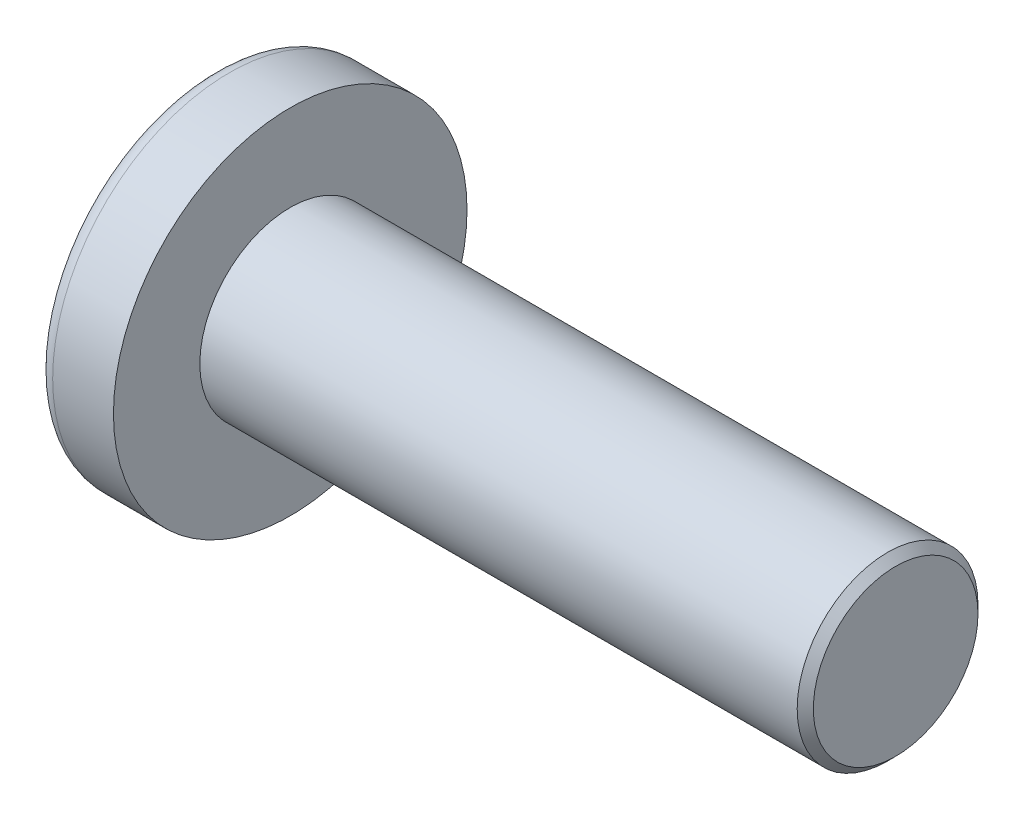
ISO-10303-21;
HEADER;
FILE_DESCRIPTION(('STEP AP214'),'2;1');
FILE_NAME('part.step','',(''),(''),'','','');
FILE_SCHEMA(('AUTOMOTIVE_DESIGN { 1 0 10303 214 1 1 1 1 }'));
ENDSEC;
DATA;
#1=APPLICATION_CONTEXT('core data for automotive mechanical design processes');
#2=APPLICATION_PROTOCOL_DEFINITION('international standard','automotive_design',2000,#1);
#3=PRODUCT_CONTEXT('',#1,'mechanical');
#4=PRODUCT('Part','Part','',(#3));
#5=PRODUCT_RELATED_PRODUCT_CATEGORY('part','',(#4));
#6=PRODUCT_DEFINITION_FORMATION('','',#4);
#7=PRODUCT_DEFINITION_CONTEXT('part definition',#1,'design');
#8=PRODUCT_DEFINITION('design','',#6,#7);
#9=PRODUCT_DEFINITION_SHAPE('','',#8);
#10=(LENGTH_UNIT() NAMED_UNIT(*) SI_UNIT(.MILLI.,.METRE.));
#11=(NAMED_UNIT(*) PLANE_ANGLE_UNIT() SI_UNIT($,.RADIAN.));
#12=(NAMED_UNIT(*) SI_UNIT($,.STERADIAN.) SOLID_ANGLE_UNIT());
#13=UNCERTAINTY_MEASURE_WITH_UNIT(LENGTH_MEASURE(1.E-05),#10,'distance_accuracy_value','');
#14=(GEOMETRIC_REPRESENTATION_CONTEXT(3) GLOBAL_UNCERTAINTY_ASSIGNED_CONTEXT((#13)) GLOBAL_UNIT_ASSIGNED_CONTEXT((#10,
#11,#12)) REPRESENTATION_CONTEXT('',''));
#15=CARTESIAN_POINT('',(0.,0.,0.));
#16=DIRECTION('',(0.,0.,1.));
#17=DIRECTION('',(1.,0.,0.));
#18=AXIS2_PLACEMENT_3D('',#15,#16,#17);
#19=CARTESIAN_POINT('',(4.55168,0.,0.));
#20=DIRECTION('',(-1.,0.,0.));
#21=DIRECTION('',(0.,1.,0.));
#22=AXIS2_PLACEMENT_3D('',#19,#20,#21);
#23=SPHERICAL_SURFACE('',#22,4.55168);
#24=CARTESIAN_POINT('',(0.870207289833471,0.,0.));
#25=DIRECTION('',(-1.,0.,0.));
#26=DIRECTION('',(0.,0.,1.));
#27=AXIS2_PLACEMENT_3D('',#24,#25,#26);
#28=CIRCLE('',#27,2.67666761229315);
#29=CARTESIAN_POINT('',(0.870207289833471,0.,2.67666761229315));
#30=VERTEX_POINT('',#29);
#31=EDGE_CURVE('E139',#30,#30,#28,.T.);
#32=ORIENTED_EDGE('',*,*,#31,.T.);
#33=EDGE_LOOP('',(#32));
#34=FACE_BOUND('',#33,.T.);
#35=CARTESIAN_POINT('',(4.54621406502776,-0.053976107850912,0.));
#36=DIRECTION('',(-0.100750553686815,-0.9949117176573,0.));
#37=DIRECTION('',(0.994911717657301,-0.100750553686815,0.));
#38=AXIS2_PLACEMENT_3D('',#35,#36,#37);
#39=CIRCLE('',#38,4.55135666870178);
#40=CARTESIAN_POINT('',(0.29828010421487,0.376194419826337,1.57634320737159));
#41=VERTEX_POINT('',#40);
#42=CARTESIAN_POINT('',(0.0357821905509178,0.402776487032817,0.402776487032818));
#43=VERTEX_POINT('',#42);
#44=EDGE_CURVE('E135',#41,#43,#39,.T.);
#45=ORIENTED_EDGE('',*,*,#44,.F.);
#46=CARTESIAN_POINT('',(3.65196023945684,0.,-1.11933639500645));
#47=DIRECTION('',(0.626498155753381,0.,0.77942290243334));
#48=DIRECTION('',(0.77942290243334,0.,-0.626498155753381));
#49=AXIS2_PLACEMENT_3D('',#46,#47,#48);
#50=CIRCLE('',#49,4.31918756361681);
#51=CARTESIAN_POINT('',(0.298280104214868,-0.376194419826347,1.57634320737159));
#52=VERTEX_POINT('',#51);
#53=EDGE_CURVE('E127',#41,#52,#50,.T.);
#54=ORIENTED_EDGE('',*,*,#53,.T.);
#55=CARTESIAN_POINT('',(4.54621406502775,0.053976107850911,0.));
#56=DIRECTION('',(-0.100750553686815,0.994911717657301,0.));
#57=DIRECTION('',(-0.994911717657301,-0.100750553686815,0.));
#58=AXIS2_PLACEMENT_3D('',#55,#56,#57);
#59=CIRCLE('',#58,4.55135666870178);
#60=CARTESIAN_POINT('',(0.0357821905509178,-0.402776487032819,0.402776487032818));
#61=VERTEX_POINT('',#60);
#62=EDGE_CURVE('E379',#61,#52,#59,.T.);
#63=ORIENTED_EDGE('',*,*,#62,.F.);
#64=CARTESIAN_POINT('',(4.54621406502775,0.,-0.0539761078509111));
#65=DIRECTION('',(-0.100750553686815,0.,-0.994911717657301));
#66=DIRECTION('',(-0.994911717657301,0.,0.100750553686815));
#67=AXIS2_PLACEMENT_3D('',#64,#65,#66);
#68=CIRCLE('',#67,4.55135666870178);
#69=CARTESIAN_POINT('',(0.298280104214867,-1.57634320737159,0.376194419826342));
#70=VERTEX_POINT('',#69);
#71=EDGE_CURVE('E173',#70,#61,#68,.T.);
#72=ORIENTED_EDGE('',*,*,#71,.F.);
#73=CARTESIAN_POINT('',(3.65196023945684,1.11933639500645,0.));
#74=DIRECTION('',(0.626498155753381,-0.77942290243334,0.));
#75=DIRECTION('',(0.77942290243334,0.626498155753381,0.));
#76=AXIS2_PLACEMENT_3D('',#73,#74,#75);
#77=CIRCLE('',#76,4.31918756361681);
#78=CARTESIAN_POINT('',(0.298280104214867,-1.57634320737159,-0.376194419826343));
#79=VERTEX_POINT('',#78);
#80=EDGE_CURVE('E169',#70,#79,#77,.T.);
#81=ORIENTED_EDGE('',*,*,#80,.T.);
#82=CARTESIAN_POINT('',(4.54621406502775,0.,0.053976107850912));
#83=DIRECTION('',(-0.100750553686815,0.,0.9949117176573));
#84=DIRECTION('',(0.994911717657301,0.,0.100750553686815));
#85=AXIS2_PLACEMENT_3D('',#82,#83,#84);
#86=CIRCLE('',#85,4.55135666870178);
#87=CARTESIAN_POINT('',(0.0357821905509169,-0.402776487032816,-0.402776487032819));
#88=VERTEX_POINT('',#87);
#89=EDGE_CURVE('E53',#88,#79,#86,.T.);
#90=ORIENTED_EDGE('',*,*,#89,.F.);
#91=CARTESIAN_POINT('',(0.298280104214869,-0.376194419826336,-1.57634320737159));
#92=VERTEX_POINT('',#91);
#93=EDGE_CURVE('E377',#92,#88,#59,.T.);
#94=ORIENTED_EDGE('',*,*,#93,.F.);
#95=CARTESIAN_POINT('',(3.65196023945684,0.,1.11933639500645));
#96=DIRECTION('',(0.626498155753381,0.,-0.77942290243334));
#97=DIRECTION('',(-0.77942290243334,0.,-0.626498155753381));
#98=AXIS2_PLACEMENT_3D('',#95,#96,#97);
#99=CIRCLE('',#98,4.31918756361681);
#100=CARTESIAN_POINT('',(0.29828010421487,0.376194419826348,-1.57634320737159));
#101=VERTEX_POINT('',#100);
#102=EDGE_CURVE('E384',#92,#101,#99,.T.);
#103=ORIENTED_EDGE('',*,*,#102,.T.);
#104=CARTESIAN_POINT('',(0.0357821905509186,0.40277648703282,-0.402776487032818));
#105=VERTEX_POINT('',#104);
#106=EDGE_CURVE('E112',#105,#101,#39,.T.);
#107=ORIENTED_EDGE('',*,*,#106,.F.);
#108=CARTESIAN_POINT('',(0.29828010421487,1.57634320737159,-0.376194419826342));
#109=VERTEX_POINT('',#108);
#110=EDGE_CURVE('E134',#109,#105,#86,.T.);
#111=ORIENTED_EDGE('',*,*,#110,.F.);
#112=CARTESIAN_POINT('',(3.65196023945684,-1.11933639500645,0.));
#113=DIRECTION('',(0.626498155753381,0.77942290243334,0.));
#114=DIRECTION('',(-0.77942290243334,0.626498155753381,0.));
#115=AXIS2_PLACEMENT_3D('',#112,#113,#114);
#116=CIRCLE('',#115,4.31918756361681);
#117=CARTESIAN_POINT('',(0.29828010421487,1.57634320737159,0.376194419826342));
#118=VERTEX_POINT('',#117);
#119=EDGE_CURVE('E61',#109,#118,#116,.T.);
#120=ORIENTED_EDGE('',*,*,#119,.T.);
#121=EDGE_CURVE('E172',#43,#118,#68,.T.);
#122=ORIENTED_EDGE('',*,*,#121,.F.);
#123=EDGE_LOOP('',(#45,#54,#63,#72,#81,#90,#94,#103,#107,#111,#120,#122));
#124=FACE_BOUND('',#123,.T.);
#125=ADVANCED_FACE('F38',(#34,#124),#23,.T.);
#126=CARTESIAN_POINT('',(2.2594,0.,-0.1776));
#127=DIRECTION('',(-0.100750553686815,0.,0.9949117176573));
#128=DIRECTION('',(0.994911717657301,0.,0.100750553686815));
#129=AXIS2_PLACEMENT_3D('',#126,#127,#128);
#130=PLANE('',#129);
#131=ORIENTED_EDGE('',*,*,#110,.T.);
#132=DIRECTION('',(0.989900325021556,-0.100243070888259,0.100243070888259));
#133=VECTOR('',#132,1.);
#134=CARTESIAN_POINT('',(2.27702336316533,0.175815355628828,-0.175815355628827));
#135=LINE('',#134,#133);
#136=CARTESIAN_POINT('',(2.0066,0.203200000000001,-0.203199999999999));
#137=VERTEX_POINT('',#136);
#138=EDGE_CURVE('E110',#105,#137,#135,.T.);
#139=ORIENTED_EDGE('',*,*,#138,.T.);
#140=DIRECTION('',(0.777006374114706,-0.624555756408656,0.0786841897837678));
#141=VECTOR('',#140,1.);
#142=CARTESIAN_POINT('',(0.,1.8161,-0.4064));
#143=LINE('',#142,#141);
#144=EDGE_CURVE('E132',#109,#137,#143,.T.);
#145=ORIENTED_EDGE('',*,*,#144,.F.);
#146=EDGE_LOOP('',(#131,#139,#145));
#147=FACE_BOUND('',#146,.T.);
#148=ADVANCED_FACE('F131',(#147),#130,.T.);
#149=DIRECTION('',(0.777006374114707,0.624555756408656,0.0786841897837678));
#150=VECTOR('',#149,1.);
#151=CARTESIAN_POINT('',(0.,-1.8161,-0.4064));
#152=LINE('',#151,#150);
#153=CARTESIAN_POINT('',(2.0066,-0.2032,-0.2032));
#154=VERTEX_POINT('',#153);
#155=EDGE_CURVE('E154',#79,#154,#152,.T.);
#156=ORIENTED_EDGE('',*,*,#155,.T.);
#157=DIRECTION('',(-0.989900325021557,-0.100243070888258,-0.100243070888259));
#158=VECTOR('',#157,1.);
#159=CARTESIAN_POINT('',(2.27702336316533,-0.175815355628826,-0.175815355628827));
#160=LINE('',#159,#158);
#161=EDGE_CURVE('E368',#154,#88,#160,.T.);
#162=ORIENTED_EDGE('',*,*,#161,.T.);
#163=ORIENTED_EDGE('',*,*,#89,.T.);
#164=EDGE_LOOP('',(#156,#162,#163));
#165=FACE_BOUND('',#164,.T.);
#166=ADVANCED_FACE('F202',(#165),#130,.T.);
#167=CARTESIAN_POINT('',(2.2594,0.,0.1776));
#168=DIRECTION('',(-0.100750553686815,0.,-0.994911717657301));
#169=DIRECTION('',(-0.994911717657301,0.,0.100750553686815));
#170=AXIS2_PLACEMENT_3D('',#167,#168,#169);
#171=PLANE('',#170);
#172=DIRECTION('',(0.777006374114706,-0.624555756408657,-0.0786841897837675));
#173=VECTOR('',#172,1.);
#174=CARTESIAN_POINT('',(0.,1.8161,0.406399999999999));
#175=LINE('',#174,#173);
#176=CARTESIAN_POINT('',(2.0066,0.2032,0.2032));
#177=VERTEX_POINT('',#176);
#178=EDGE_CURVE('E140',#118,#177,#175,.T.);
#179=ORIENTED_EDGE('',*,*,#178,.T.);
#180=DIRECTION('',(-0.989900325021557,0.100243070888259,0.100243070888259));
#181=VECTOR('',#180,1.);
#182=CARTESIAN_POINT('',(2.27702336316533,0.175815355628826,0.175815355628827));
#183=LINE('',#182,#181);
#184=EDGE_CURVE('E374',#177,#43,#183,.T.);
#185=ORIENTED_EDGE('',*,*,#184,.T.);
#186=ORIENTED_EDGE('',*,*,#121,.T.);
#187=EDGE_LOOP('',(#179,#185,#186));
#188=FACE_BOUND('',#187,.T.);
#189=ADVANCED_FACE('F233',(#188),#171,.T.);
#190=ORIENTED_EDGE('',*,*,#71,.T.);
#191=DIRECTION('',(0.989900325021556,0.100243070888259,-0.100243070888259));
#192=VECTOR('',#191,1.);
#193=CARTESIAN_POINT('',(2.27702336316533,-0.175815355628828,0.175815355628827));
#194=LINE('',#193,#192);
#195=CARTESIAN_POINT('',(2.0066,-0.203200000000001,0.203199999999999));
#196=VERTEX_POINT('',#195);
#197=EDGE_CURVE('E381',#61,#196,#194,.T.);
#198=ORIENTED_EDGE('',*,*,#197,.T.);
#199=DIRECTION('',(0.777006374114707,0.624555756408656,-0.0786841897837674));
#200=VECTOR('',#199,1.);
#201=CARTESIAN_POINT('',(0.,-1.8161,0.406399999999999));
#202=LINE('',#201,#200);
#203=EDGE_CURVE('E151',#70,#196,#202,.T.);
#204=ORIENTED_EDGE('',*,*,#203,.F.);
#205=EDGE_LOOP('',(#190,#198,#204));
#206=FACE_BOUND('',#205,.T.);
#207=ADVANCED_FACE('F222',(#206),#171,.T.);
#208=CARTESIAN_POINT('',(-25.4,0.,0.));
#209=DIRECTION('',(-1.,0.,0.));
#210=DIRECTION('',(0.,0.,1.));
#211=AXIS2_PLACEMENT_3D('',#208,#209,#210);
#212=CYLINDRICAL_SURFACE('',#211,1.4224);
#213=CARTESIAN_POINT('',(11.43,0.,0.));
#214=DIRECTION('',(1.,0.,0.));
#215=DIRECTION('',(0.,0.,-1.));
#216=AXIS2_PLACEMENT_3D('',#213,#214,#215);
#217=CIRCLE('',#216,1.4224);
#218=CARTESIAN_POINT('',(11.43,0.,-1.4224));
#219=VERTEX_POINT('',#218);
#220=EDGE_CURVE('E46',#219,#219,#217,.F.);
#221=ORIENTED_EDGE('',*,*,#220,.T.);
#222=EDGE_LOOP('',(#221));
#223=FACE_BOUND('',#222,.T.);
#224=CARTESIAN_POINT('',(2.032,0.,0.));
#225=DIRECTION('',(-1.,0.,0.));
#226=DIRECTION('',(0.,0.,1.));
#227=AXIS2_PLACEMENT_3D('',#224,#225,#226);
#228=CIRCLE('',#227,1.4224);
#229=CARTESIAN_POINT('',(2.032,0.,1.4224));
#230=VERTEX_POINT('',#229);
#231=EDGE_CURVE('E166',#230,#230,#228,.T.);
#232=ORIENTED_EDGE('',*,*,#231,.F.);
#233=EDGE_LOOP('',(#232));
#234=FACE_BOUND('',#233,.T.);
#235=ADVANCED_FACE('F40',(#223,#234),#212,.T.);
#236=CARTESIAN_POINT('',(2.032,1.4224,0.));
#237=DIRECTION('',(-1.,0.,0.));
#238=DIRECTION('',(0.,0.,1.));
#239=AXIS2_PLACEMENT_3D('',#236,#237,#238);
#240=PLANE('',#239);
#241=CARTESIAN_POINT('',(2.032,0.,0.));
#242=DIRECTION('',(-1.,0.,0.));
#243=DIRECTION('',(0.,0.,1.));
#244=AXIS2_PLACEMENT_3D('',#241,#242,#243);
#245=CIRCLE('',#244,2.7813);
#246=CARTESIAN_POINT('',(2.032,0.,2.7813));
#247=VERTEX_POINT('',#246);
#248=EDGE_CURVE('E163',#247,#247,#245,.T.);
#249=ORIENTED_EDGE('',*,*,#248,.F.);
#250=EDGE_LOOP('',(#249));
#251=FACE_BOUND('',#250,.T.);
#252=ORIENTED_EDGE('',*,*,#231,.T.);
#253=EDGE_LOOP('',(#252));
#254=FACE_BOUND('',#253,.T.);
#255=ADVANCED_FACE('F215',(#251,#254),#240,.F.);
#256=CARTESIAN_POINT('',(-25.4,0.,0.));
#257=DIRECTION('',(-1.,0.,0.));
#258=DIRECTION('',(0.,0.,1.));
#259=AXIS2_PLACEMENT_3D('',#256,#257,#258);
#260=CYLINDRICAL_SURFACE('',#259,2.7813);
#261=ORIENTED_EDGE('',*,*,#248,.T.);
#262=EDGE_LOOP('',(#261));
#263=FACE_BOUND('',#262,.T.);
#264=CARTESIAN_POINT('',(1.07564661517759,0.,0.));
#265=DIRECTION('',(-1.,0.,0.));
#266=DIRECTION('',(0.,0.,1.));
#267=AXIS2_PLACEMENT_3D('',#264,#265,#266);
#268=CIRCLE('',#267,2.7813);
#269=CARTESIAN_POINT('',(1.07564661517759,0.,2.7813));
#270=VERTEX_POINT('',#269);
#271=EDGE_CURVE('E160',#270,#270,#268,.T.);
#272=ORIENTED_EDGE('',*,*,#271,.F.);
#273=EDGE_LOOP('',(#272));
#274=FACE_BOUND('',#273,.T.);
#275=ADVANCED_FACE('F212',(#263,#274),#260,.T.);
#276=CARTESIAN_POINT('',(1.07564661517759,0.,0.));
#277=DIRECTION('',(-1.,0.,0.));
#278=DIRECTION('',(0.,0.,1.));
#279=AXIS2_PLACEMENT_3D('',#276,#277,#278);
#280=TOROIDAL_SURFACE('',#279,2.5273,0.254);
#281=ORIENTED_EDGE('',*,*,#271,.T.);
#282=EDGE_LOOP('',(#281));
#283=FACE_BOUND('',#282,.T.);
#284=ORIENTED_EDGE('',*,*,#31,.F.);
#285=EDGE_LOOP('',(#284));
#286=FACE_BOUND('',#285,.T.);
#287=ADVANCED_FACE('F209',(#283,#286),#280,.T.);
#288=CARTESIAN_POINT('',(11.557,1.4224,0.));
#289=DIRECTION('',(1.,0.,0.));
#290=DIRECTION('',(0.,0.,-1.));
#291=AXIS2_PLACEMENT_3D('',#288,#289,#290);
#292=PLANE('',#291);
#293=CARTESIAN_POINT('',(11.557,0.,0.));
#294=DIRECTION('',(1.,0.,0.));
#295=DIRECTION('',(0.,0.,-1.));
#296=AXIS2_PLACEMENT_3D('',#293,#294,#295);
#297=CIRCLE('',#296,1.2954);
#298=CARTESIAN_POINT('',(11.557,0.,-1.2954));
#299=VERTEX_POINT('',#298);
#300=EDGE_CURVE('E11',#299,#299,#297,.T.);
#301=ORIENTED_EDGE('',*,*,#300,.T.);
#302=EDGE_LOOP('',(#301));
#303=FACE_BOUND('',#302,.T.);
#304=ADVANCED_FACE('F207',(#303),#292,.T.);
#305=CARTESIAN_POINT('',(2.0066,0.2032,0.2032));
#306=DIRECTION('',(0.626498155753381,0.77942290243334,0.));
#307=DIRECTION('',(-0.77942290243334,0.626498155753381,0.));
#308=AXIS2_PLACEMENT_3D('',#305,#306,#307);
#309=PLANE('',#308);
#310=ORIENTED_EDGE('',*,*,#144,.T.);
#311=DIRECTION('',(0.,0.,-1.));
#312=VECTOR('',#311,1.);
#313=CARTESIAN_POINT('',(2.0066,0.2032,0.2032));
#314=LINE('',#313,#312);
#315=EDGE_CURVE('E126',#177,#137,#314,.T.);
#316=ORIENTED_EDGE('',*,*,#315,.F.);
#317=ORIENTED_EDGE('',*,*,#178,.F.);
#318=ORIENTED_EDGE('',*,*,#119,.F.);
#319=EDGE_LOOP('',(#310,#316,#317,#318));
#320=FACE_BOUND('',#319,.T.);
#321=ADVANCED_FACE('F138',(#320),#309,.F.);
#322=CARTESIAN_POINT('',(2.0066,-0.2032,-0.2032));
#323=DIRECTION('',(0.626498155753381,-0.77942290243334,0.));
#324=DIRECTION('',(0.77942290243334,0.626498155753381,0.));
#325=AXIS2_PLACEMENT_3D('',#322,#323,#324);
#326=PLANE('',#325);
#327=ORIENTED_EDGE('',*,*,#203,.T.);
#328=DIRECTION('',(0.,0.,1.));
#329=VECTOR('',#328,1.);
#330=CARTESIAN_POINT('',(2.0066,-0.2032,-0.2032));
#331=LINE('',#330,#329);
#332=EDGE_CURVE('E147',#154,#196,#331,.T.);
#333=ORIENTED_EDGE('',*,*,#332,.F.);
#334=ORIENTED_EDGE('',*,*,#155,.F.);
#335=ORIENTED_EDGE('',*,*,#80,.F.);
#336=EDGE_LOOP('',(#327,#333,#334,#335));
#337=FACE_BOUND('',#336,.T.);
#338=ADVANCED_FACE('F241',(#337),#326,.F.);
#339=CARTESIAN_POINT('',(2.0066,0.2032,-0.2032));
#340=DIRECTION('',(-1.,0.,0.));
#341=DIRECTION('',(0.,0.,1.));
#342=AXIS2_PLACEMENT_3D('',#339,#340,#341);
#343=PLANE('',#342);
#344=DIRECTION('',(0.,1.,0.));
#345=VECTOR('',#344,1.);
#346=CARTESIAN_POINT('',(2.0066,-0.2032,-0.2032));
#347=LINE('',#346,#345);
#348=EDGE_CURVE('E119',#154,#137,#347,.T.);
#349=ORIENTED_EDGE('',*,*,#348,.F.);
#350=ORIENTED_EDGE('',*,*,#332,.T.);
#351=DIRECTION('',(0.,-1.,0.));
#352=VECTOR('',#351,1.);
#353=CARTESIAN_POINT('',(2.0066,0.2032,0.2032));
#354=LINE('',#353,#352);
#355=EDGE_CURVE('E145',#177,#196,#354,.T.);
#356=ORIENTED_EDGE('',*,*,#355,.F.);
#357=ORIENTED_EDGE('',*,*,#315,.T.);
#358=EDGE_LOOP('',(#349,#350,#356,#357));
#359=FACE_BOUND('',#358,.T.);
#360=ADVANCED_FACE('F143',(#359),#343,.T.);
#361=CARTESIAN_POINT('',(2.0066,0.203200000000001,-0.203199999999999));
#362=DIRECTION('',(0.626498155753381,0.,-0.77942290243334));
#363=DIRECTION('',(0.77942290243334,0.,0.626498155753381));
#364=AXIS2_PLACEMENT_3D('',#361,#362,#363);
#365=PLANE('',#364);
#366=DIRECTION('',(0.777006374114707,0.0786841897837653,0.624555756408656));
#367=VECTOR('',#366,1.);
#368=CARTESIAN_POINT('',(0.,-0.406399999999993,-1.8161));
#369=LINE('',#368,#367);
#370=EDGE_CURVE('E116',#92,#154,#369,.T.);
#371=ORIENTED_EDGE('',*,*,#370,.T.);
#372=ORIENTED_EDGE('',*,*,#348,.T.);
#373=DIRECTION('',(0.777006374114707,-0.0786841897837699,0.624555756408656));
#374=VECTOR('',#373,1.);
#375=CARTESIAN_POINT('',(0.,0.406400000000006,-1.8161));
#376=LINE('',#375,#374);
#377=EDGE_CURVE('E106',#101,#137,#376,.T.);
#378=ORIENTED_EDGE('',*,*,#377,.F.);
#379=ORIENTED_EDGE('',*,*,#102,.F.);
#380=EDGE_LOOP('',(#371,#372,#378,#379));
#381=FACE_BOUND('',#380,.T.);
#382=ADVANCED_FACE('F120',(#381),#365,.F.);
#383=CARTESIAN_POINT('',(2.2594,-0.1776,0.));
#384=DIRECTION('',(-0.100750553686815,0.994911717657301,0.));
#385=DIRECTION('',(-0.994911717657301,-0.100750553686815,0.));
#386=AXIS2_PLACEMENT_3D('',#383,#384,#385);
#387=PLANE('',#386);
#388=ORIENTED_EDGE('',*,*,#93,.T.);
#389=ORIENTED_EDGE('',*,*,#161,.F.);
#390=ORIENTED_EDGE('',*,*,#370,.F.);
#391=EDGE_LOOP('',(#388,#389,#390));
#392=FACE_BOUND('',#391,.T.);
#393=ADVANCED_FACE('F193',(#392),#387,.T.);
#394=CARTESIAN_POINT('',(2.2594,0.1776,0.));
#395=DIRECTION('',(-0.100750553686815,-0.9949117176573,0.));
#396=DIRECTION('',(0.994911717657301,-0.100750553686815,0.));
#397=AXIS2_PLACEMENT_3D('',#394,#395,#396);
#398=PLANE('',#397);
#399=ORIENTED_EDGE('',*,*,#106,.T.);
#400=ORIENTED_EDGE('',*,*,#377,.T.);
#401=ORIENTED_EDGE('',*,*,#138,.F.);
#402=EDGE_LOOP('',(#399,#400,#401));
#403=FACE_BOUND('',#402,.T.);
#404=ADVANCED_FACE('F108',(#403),#398,.T.);
#405=CARTESIAN_POINT('',(2.0066,-0.203200000000001,0.203199999999999));
#406=DIRECTION('',(0.626498155753381,0.,0.77942290243334));
#407=DIRECTION('',(-0.77942290243334,0.,0.626498155753381));
#408=AXIS2_PLACEMENT_3D('',#405,#406,#407);
#409=PLANE('',#408);
#410=DIRECTION('',(0.777006374114706,-0.0786841897837656,-0.624555756408657));
#411=VECTOR('',#410,1.);
#412=CARTESIAN_POINT('',(0.,0.406399999999994,1.8161));
#413=LINE('',#412,#411);
#414=EDGE_CURVE('E386',#41,#177,#413,.T.);
#415=ORIENTED_EDGE('',*,*,#414,.T.);
#416=ORIENTED_EDGE('',*,*,#355,.T.);
#417=DIRECTION('',(0.777006374114706,0.0786841897837697,-0.624555756408656));
#418=VECTOR('',#417,1.);
#419=CARTESIAN_POINT('',(0.,-0.406400000000006,1.8161));
#420=LINE('',#419,#418);
#421=EDGE_CURVE('E115',#52,#196,#420,.T.);
#422=ORIENTED_EDGE('',*,*,#421,.F.);
#423=ORIENTED_EDGE('',*,*,#53,.F.);
#424=EDGE_LOOP('',(#415,#416,#422,#423));
#425=FACE_BOUND('',#424,.T.);
#426=ADVANCED_FACE('F287',(#425),#409,.F.);
#427=ORIENTED_EDGE('',*,*,#44,.T.);
#428=ORIENTED_EDGE('',*,*,#184,.F.);
#429=ORIENTED_EDGE('',*,*,#414,.F.);
#430=EDGE_LOOP('',(#427,#428,#429));
#431=FACE_BOUND('',#430,.T.);
#432=ADVANCED_FACE('F190',(#431),#398,.T.);
#433=ORIENTED_EDGE('',*,*,#62,.T.);
#434=ORIENTED_EDGE('',*,*,#421,.T.);
#435=ORIENTED_EDGE('',*,*,#197,.F.);
#436=EDGE_LOOP('',(#433,#434,#435));
#437=FACE_BOUND('',#436,.T.);
#438=ADVANCED_FACE('F184',(#437),#387,.T.);
#439=CARTESIAN_POINT('',(11.43,0.,0.));
#440=DIRECTION('',(-1.,0.,0.));
#441=DIRECTION('',(0.,0.,1.));
#442=AXIS2_PLACEMENT_3D('',#439,#440,#441);
#443=CONICAL_SURFACE('',#442,1.4224,0.785398163397444);
#444=ORIENTED_EDGE('',*,*,#300,.F.);
#445=EDGE_LOOP('',(#444));
#446=FACE_BOUND('',#445,.T.);
#447=ORIENTED_EDGE('',*,*,#220,.F.);
#448=EDGE_LOOP('',(#447));
#449=FACE_BOUND('',#448,.T.);
#450=ADVANCED_FACE('F182',(#446,#449),#443,.T.);
#451=CLOSED_SHELL('',(#125,#148,#166,#189,#207,#235,#255,#275,#287,#304,#321,#338,#360,#382,
#393,#404,#426,#432,#438,#450));
#452=MANIFOLD_SOLID_BREP('B2',#451);
#453=ADVANCED_BREP_SHAPE_REPRESENTATION('',(#18,#452),#14);
#454=SHAPE_DEFINITION_REPRESENTATION(#9,#453);
ENDSEC;
END-ISO-10303-21;
